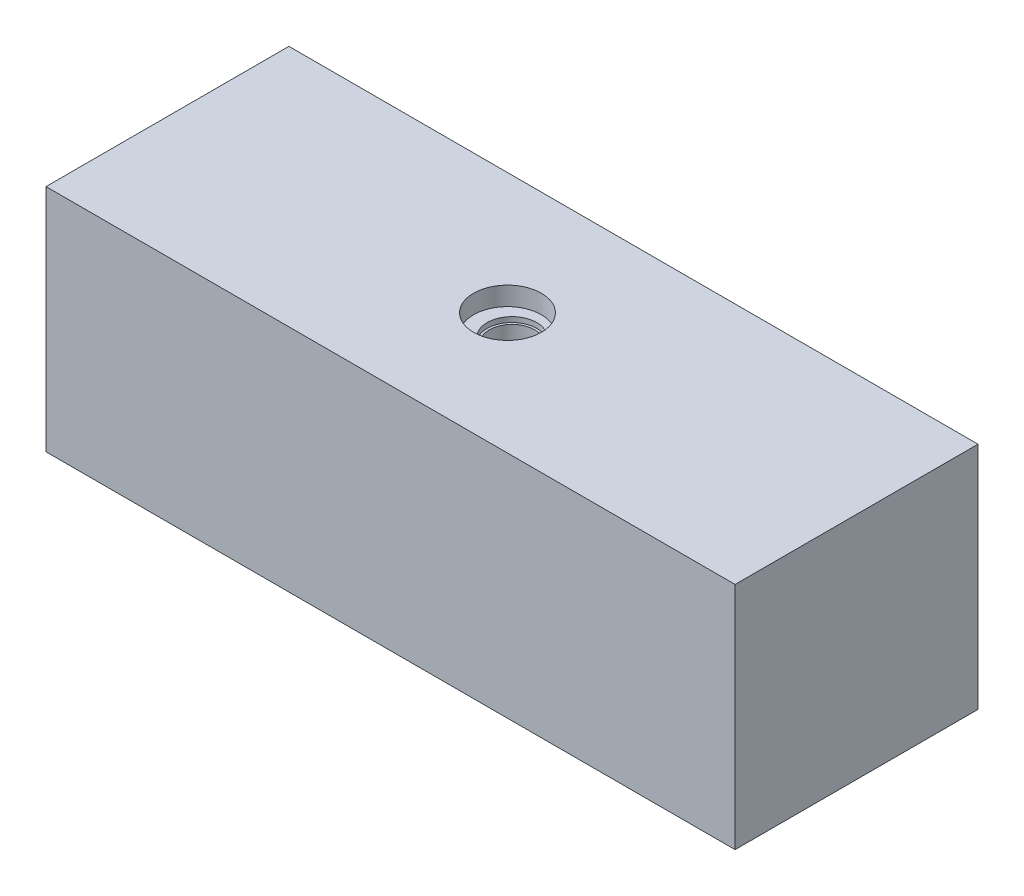
ISO-10303-21;
HEADER;
FILE_DESCRIPTION(('STEP AP214'),'2;1');
FILE_NAME('part.step','',(''),(''),'','','');
FILE_SCHEMA(('AUTOMOTIVE_DESIGN { 1 0 10303 214 1 1 1 1 }'));
ENDSEC;
DATA;
#1=APPLICATION_CONTEXT('core data for automotive mechanical design processes');
#2=APPLICATION_PROTOCOL_DEFINITION('international standard','automotive_design',2000,#1);
#3=PRODUCT_CONTEXT('',#1,'mechanical');
#4=PRODUCT('Part','Part','',(#3));
#5=PRODUCT_RELATED_PRODUCT_CATEGORY('part','',(#4));
#6=PRODUCT_DEFINITION_FORMATION('','',#4);
#7=PRODUCT_DEFINITION_CONTEXT('part definition',#1,'design');
#8=PRODUCT_DEFINITION('design','',#6,#7);
#9=PRODUCT_DEFINITION_SHAPE('','',#8);
#10=(LENGTH_UNIT() NAMED_UNIT(*) SI_UNIT(.MILLI.,.METRE.));
#11=(NAMED_UNIT(*) PLANE_ANGLE_UNIT() SI_UNIT($,.RADIAN.));
#12=(NAMED_UNIT(*) SI_UNIT($,.STERADIAN.) SOLID_ANGLE_UNIT());
#13=UNCERTAINTY_MEASURE_WITH_UNIT(LENGTH_MEASURE(1.E-05),#10,'distance_accuracy_value','');
#14=(GEOMETRIC_REPRESENTATION_CONTEXT(3) GLOBAL_UNCERTAINTY_ASSIGNED_CONTEXT((#13)) GLOBAL_UNIT_ASSIGNED_CONTEXT((#10,
#11,#12)) REPRESENTATION_CONTEXT('',''));
#15=CARTESIAN_POINT('',(0.,0.,0.));
#16=DIRECTION('',(0.,0.,1.));
#17=DIRECTION('',(1.,0.,0.));
#18=AXIS2_PLACEMENT_3D('',#15,#16,#17);
#19=CARTESIAN_POINT('',(0.,45.545833,0.));
#20=DIRECTION('',(0.,1.,0.));
#21=DIRECTION('',(0.,0.,1.));
#22=AXIS2_PLACEMENT_3D('',#19,#20,#21);
#23=CYLINDRICAL_SURFACE('',#22,5.5);
#24=CARTESIAN_POINT('',(0.,45.545833,0.));
#25=DIRECTION('',(0.,1.,0.));
#26=DIRECTION('',(0.,0.,1.));
#27=AXIS2_PLACEMENT_3D('',#24,#25,#26);
#28=CIRCLE('',#27,5.5);
#29=CARTESIAN_POINT('',(0.,45.545833,5.5));
#30=VERTEX_POINT('',#29);
#31=EDGE_CURVE('E137',#30,#30,#28,.T.);
#32=ORIENTED_EDGE('',*,*,#31,.F.);
#33=EDGE_LOOP('',(#32));
#34=FACE_BOUND('',#33,.T.);
#35=CARTESIAN_POINT('',(0.,46.676894,0.));
#36=DIRECTION('',(0.,1.,0.));
#37=DIRECTION('',(0.,0.,1.));
#38=AXIS2_PLACEMENT_3D('',#35,#36,#37);
#39=CIRCLE('',#38,5.5);
#40=CARTESIAN_POINT('',(0.,46.676894,5.5));
#41=VERTEX_POINT('',#40);
#42=EDGE_CURVE('E150',#41,#41,#39,.T.);
#43=ORIENTED_EDGE('',*,*,#42,.T.);
#44=EDGE_LOOP('',(#43));
#45=FACE_BOUND('',#44,.T.);
#46=ADVANCED_FACE('F44',(#34,#45),#23,.F.);
#47=CARTESIAN_POINT('',(0.,45.545833,0.));
#48=DIRECTION('',(0.,1.,0.));
#49=DIRECTION('',(0.,0.,1.));
#50=AXIS2_PLACEMENT_3D('',#47,#48,#49);
#51=PLANE('',#50);
#52=CARTESIAN_POINT('',(0.,45.545833,0.));
#53=DIRECTION('',(0.,1.,0.));
#54=DIRECTION('',(0.,0.,1.));
#55=AXIS2_PLACEMENT_3D('',#52,#53,#54);
#56=CIRCLE('',#55,5.);
#57=CARTESIAN_POINT('',(0.,45.545833,5.));
#58=VERTEX_POINT('',#57);
#59=EDGE_CURVE('E141',#58,#58,#56,.T.);
#60=ORIENTED_EDGE('',*,*,#59,.F.);
#61=EDGE_LOOP('',(#60));
#62=FACE_BOUND('',#61,.T.);
#63=ORIENTED_EDGE('',*,*,#31,.T.);
#64=EDGE_LOOP('',(#63));
#65=FACE_BOUND('',#64,.T.);
#66=ADVANCED_FACE('F180',(#62,#65),#51,.T.);
#67=CARTESIAN_POINT('',(0.,31.383333,0.));
#68=DIRECTION('',(0.,1.,0.));
#69=DIRECTION('',(0.,0.,1.));
#70=AXIS2_PLACEMENT_3D('',#67,#68,#69);
#71=PLANE('',#70);
#72=CARTESIAN_POINT('',(0.,31.383333,0.));
#73=DIRECTION('',(0.,1.,0.));
#74=DIRECTION('',(0.,0.,1.));
#75=AXIS2_PLACEMENT_3D('',#72,#73,#74);
#76=CIRCLE('',#75,5.);
#77=CARTESIAN_POINT('',(0.,31.383333,5.));
#78=VERTEX_POINT('',#77);
#79=EDGE_CURVE('E117',#78,#78,#76,.T.);
#80=ORIENTED_EDGE('',*,*,#79,.T.);
#81=EDGE_LOOP('',(#80));
#82=FACE_BOUND('',#81,.T.);
#83=ADVANCED_FACE('F187',(#82),#71,.T.);
#84=CARTESIAN_POINT('',(0.,31.383333,0.));
#85=DIRECTION('',(0.,1.,0.));
#86=DIRECTION('',(0.,0.,1.));
#87=AXIS2_PLACEMENT_3D('',#84,#85,#86);
#88=CYLINDRICAL_SURFACE('',#87,5.);
#89=ORIENTED_EDGE('',*,*,#79,.F.);
#90=EDGE_LOOP('',(#89));
#91=FACE_BOUND('',#90,.T.);
#92=ORIENTED_EDGE('',*,*,#59,.T.);
#93=EDGE_LOOP('',(#92));
#94=FACE_BOUND('',#93,.T.);
#95=ADVANCED_FACE('F168',(#91,#94),#88,.F.);
#96=CARTESIAN_POINT('',(-1.,46.676894,0.));
#97=DIRECTION('',(0.,1.,0.));
#98=DIRECTION('',(0.,0.,1.));
#99=AXIS2_PLACEMENT_3D('',#96,#97,#98);
#100=CYLINDRICAL_SURFACE('',#99,7.5);
#101=CARTESIAN_POINT('',(-1.,46.676894,0.));
#102=DIRECTION('',(0.,1.,0.));
#103=DIRECTION('',(0.,0.,1.));
#104=AXIS2_PLACEMENT_3D('',#101,#102,#103);
#105=CIRCLE('',#104,7.5);
#106=CARTESIAN_POINT('',(-1.,46.676894,7.5));
#107=VERTEX_POINT('',#106);
#108=EDGE_CURVE('E145',#107,#107,#105,.T.);
#109=ORIENTED_EDGE('',*,*,#108,.F.);
#110=EDGE_LOOP('',(#109));
#111=FACE_BOUND('',#110,.T.);
#112=CARTESIAN_POINT('',(-1.,50.8,0.));
#113=DIRECTION('',(0.,1.,0.));
#114=DIRECTION('',(0.,0.,1.));
#115=AXIS2_PLACEMENT_3D('',#112,#113,#114);
#116=CIRCLE('',#115,7.5);
#117=CARTESIAN_POINT('',(-1.,50.8,7.5));
#118=VERTEX_POINT('',#117);
#119=EDGE_CURVE('E146',#118,#118,#116,.T.);
#120=ORIENTED_EDGE('',*,*,#119,.T.);
#121=EDGE_LOOP('',(#120));
#122=FACE_BOUND('',#121,.T.);
#123=ADVANCED_FACE('F162',(#111,#122),#100,.F.);
#124=CARTESIAN_POINT('',(0.,46.676894,0.));
#125=DIRECTION('',(0.,1.,0.));
#126=DIRECTION('',(0.,0.,1.));
#127=AXIS2_PLACEMENT_3D('',#124,#125,#126);
#128=PLANE('',#127);
#129=ORIENTED_EDGE('',*,*,#42,.F.);
#130=EDGE_LOOP('',(#129));
#131=FACE_BOUND('',#130,.T.);
#132=ORIENTED_EDGE('',*,*,#108,.T.);
#133=EDGE_LOOP('',(#132));
#134=FACE_BOUND('',#133,.T.);
#135=ADVANCED_FACE('F159',(#131,#134),#128,.T.);
#136=CARTESIAN_POINT('',(0.,0.,0.));
#137=DIRECTION('',(0.,1.,0.));
#138=DIRECTION('',(0.,0.,1.));
#139=AXIS2_PLACEMENT_3D('',#136,#137,#138);
#140=PLANE('',#139);
#141=DIRECTION('',(0.,0.,1.));
#142=VECTOR('',#141,1.);
#143=CARTESIAN_POINT('',(-76.2,0.,26.8605));
#144=LINE('',#143,#142);
#145=CARTESIAN_POINT('',(-76.2,0.,-26.8605));
#146=VERTEX_POINT('',#145);
#147=CARTESIAN_POINT('',(-76.2,0.,26.8605));
#148=VERTEX_POINT('',#147);
#149=EDGE_CURVE('E113',#146,#148,#144,.T.);
#150=ORIENTED_EDGE('',*,*,#149,.F.);
#151=DIRECTION('',(-1.,0.,0.));
#152=VECTOR('',#151,1.);
#153=CARTESIAN_POINT('',(76.2,0.,-26.8605));
#154=LINE('',#153,#152);
#155=CARTESIAN_POINT('',(76.2,0.,-26.8605));
#156=VERTEX_POINT('',#155);
#157=EDGE_CURVE('E85',#156,#146,#154,.T.);
#158=ORIENTED_EDGE('',*,*,#157,.F.);
#159=DIRECTION('',(0.,0.,-1.));
#160=VECTOR('',#159,1.);
#161=CARTESIAN_POINT('',(76.2,0.,26.8605));
#162=LINE('',#161,#160);
#163=CARTESIAN_POINT('',(76.2,0.,26.8605));
#164=VERTEX_POINT('',#163);
#165=EDGE_CURVE('E79',#164,#156,#162,.T.);
#166=ORIENTED_EDGE('',*,*,#165,.F.);
#167=DIRECTION('',(1.,0.,0.));
#168=VECTOR('',#167,1.);
#169=CARTESIAN_POINT('',(76.2,0.,26.8605));
#170=LINE('',#169,#168);
#171=EDGE_CURVE('E102',#148,#164,#170,.T.);
#172=ORIENTED_EDGE('',*,*,#171,.F.);
#173=EDGE_LOOP('',(#150,#158,#166,#172));
#174=FACE_BOUND('',#173,.T.);
#175=ADVANCED_FACE('F130',(#174),#140,.F.);
#176=CARTESIAN_POINT('',(76.2,50.8,-26.8605));
#177=DIRECTION('',(0.,0.,1.));
#178=DIRECTION('',(1.,0.,0.));
#179=AXIS2_PLACEMENT_3D('',#176,#177,#178);
#180=PLANE('',#179);
#181=ORIENTED_EDGE('',*,*,#157,.T.);
#182=DIRECTION('',(0.,-1.,0.));
#183=VECTOR('',#182,1.);
#184=CARTESIAN_POINT('',(-76.2,50.8,-26.8605));
#185=LINE('',#184,#183);
#186=CARTESIAN_POINT('',(-76.2,50.8,-26.8605));
#187=VERTEX_POINT('',#186);
#188=EDGE_CURVE('E109',#187,#146,#185,.T.);
#189=ORIENTED_EDGE('',*,*,#188,.F.);
#190=DIRECTION('',(-1.,0.,0.));
#191=VECTOR('',#190,1.);
#192=CARTESIAN_POINT('',(76.2,50.8,-26.8605));
#193=LINE('',#192,#191);
#194=CARTESIAN_POINT('',(76.2,50.8,-26.8605));
#195=VERTEX_POINT('',#194);
#196=EDGE_CURVE('E62',#195,#187,#193,.T.);
#197=ORIENTED_EDGE('',*,*,#196,.F.);
#198=DIRECTION('',(0.,-1.,0.));
#199=VECTOR('',#198,1.);
#200=CARTESIAN_POINT('',(76.2,50.8,-26.8605));
#201=LINE('',#200,#199);
#202=EDGE_CURVE('E104',#195,#156,#201,.T.);
#203=ORIENTED_EDGE('',*,*,#202,.T.);
#204=EDGE_LOOP('',(#181,#189,#197,#203));
#205=FACE_BOUND('',#204,.T.);
#206=ADVANCED_FACE('F127',(#205),#180,.F.);
#207=CARTESIAN_POINT('',(76.2,50.8,26.8605));
#208=DIRECTION('',(-1.,0.,0.));
#209=DIRECTION('',(0.,0.,1.));
#210=AXIS2_PLACEMENT_3D('',#207,#208,#209);
#211=PLANE('',#210);
#212=ORIENTED_EDGE('',*,*,#165,.T.);
#213=ORIENTED_EDGE('',*,*,#202,.F.);
#214=DIRECTION('',(0.,0.,-1.));
#215=VECTOR('',#214,1.);
#216=CARTESIAN_POINT('',(76.2,50.8,26.8605));
#217=LINE('',#216,#215);
#218=CARTESIAN_POINT('',(76.2,50.8,26.8605));
#219=VERTEX_POINT('',#218);
#220=EDGE_CURVE('E95',#219,#195,#217,.T.);
#221=ORIENTED_EDGE('',*,*,#220,.F.);
#222=DIRECTION('',(0.,-1.,0.));
#223=VECTOR('',#222,1.);
#224=CARTESIAN_POINT('',(76.2,50.8,26.8605));
#225=LINE('',#224,#223);
#226=EDGE_CURVE('E54',#219,#164,#225,.T.);
#227=ORIENTED_EDGE('',*,*,#226,.T.);
#228=EDGE_LOOP('',(#212,#213,#221,#227));
#229=FACE_BOUND('',#228,.T.);
#230=ADVANCED_FACE('F105',(#229),#211,.F.);
#231=CARTESIAN_POINT('',(76.2,50.8,26.8605));
#232=DIRECTION('',(0.,0.,-1.));
#233=DIRECTION('',(-1.,0.,0.));
#234=AXIS2_PLACEMENT_3D('',#231,#232,#233);
#235=PLANE('',#234);
#236=ORIENTED_EDGE('',*,*,#171,.T.);
#237=ORIENTED_EDGE('',*,*,#226,.F.);
#238=DIRECTION('',(1.,0.,0.));
#239=VECTOR('',#238,1.);
#240=CARTESIAN_POINT('',(76.2,50.8,26.8605));
#241=LINE('',#240,#239);
#242=CARTESIAN_POINT('',(-76.2,50.8,26.8605));
#243=VERTEX_POINT('',#242);
#244=EDGE_CURVE('E92',#243,#219,#241,.T.);
#245=ORIENTED_EDGE('',*,*,#244,.F.);
#246=DIRECTION('',(0.,-1.,0.));
#247=VECTOR('',#246,1.);
#248=CARTESIAN_POINT('',(-76.2,50.8,26.8605));
#249=LINE('',#248,#247);
#250=EDGE_CURVE('E11',#243,#148,#249,.T.);
#251=ORIENTED_EDGE('',*,*,#250,.T.);
#252=EDGE_LOOP('',(#236,#237,#245,#251));
#253=FACE_BOUND('',#252,.T.);
#254=ADVANCED_FACE('F101',(#253),#235,.F.);
#255=CARTESIAN_POINT('',(-76.2,50.8,26.8605));
#256=DIRECTION('',(1.,0.,0.));
#257=DIRECTION('',(0.,0.,-1.));
#258=AXIS2_PLACEMENT_3D('',#255,#256,#257);
#259=PLANE('',#258);
#260=ORIENTED_EDGE('',*,*,#149,.T.);
#261=ORIENTED_EDGE('',*,*,#250,.F.);
#262=DIRECTION('',(0.,0.,1.));
#263=VECTOR('',#262,1.);
#264=CARTESIAN_POINT('',(-76.2,50.8,26.8605));
#265=LINE('',#264,#263);
#266=EDGE_CURVE('E97',#187,#243,#265,.T.);
#267=ORIENTED_EDGE('',*,*,#266,.F.);
#268=ORIENTED_EDGE('',*,*,#188,.T.);
#269=EDGE_LOOP('',(#260,#261,#267,#268));
#270=FACE_BOUND('',#269,.T.);
#271=ADVANCED_FACE('F46',(#270),#259,.F.);
#272=CARTESIAN_POINT('',(0.,50.8,0.));
#273=DIRECTION('',(0.,1.,0.));
#274=DIRECTION('',(0.,0.,1.));
#275=AXIS2_PLACEMENT_3D('',#272,#273,#274);
#276=PLANE('',#275);
#277=ORIENTED_EDGE('',*,*,#119,.F.);
#278=EDGE_LOOP('',(#277));
#279=FACE_BOUND('',#278,.T.);
#280=ORIENTED_EDGE('',*,*,#266,.T.);
#281=ORIENTED_EDGE('',*,*,#244,.T.);
#282=ORIENTED_EDGE('',*,*,#220,.T.);
#283=ORIENTED_EDGE('',*,*,#196,.T.);
#284=EDGE_LOOP('',(#280,#281,#282,#283));
#285=FACE_BOUND('',#284,.T.);
#286=ADVANCED_FACE('F93',(#279,#285),#276,.T.);
#287=CLOSED_SHELL('',(#46,#66,#83,#95,#123,#135,#175,#206,#230,#254,#271,#286));
#288=MANIFOLD_SOLID_BREP('B2',#287);
#289=ADVANCED_BREP_SHAPE_REPRESENTATION('',(#18,#288),#14);
#290=SHAPE_DEFINITION_REPRESENTATION(#9,#289);
ENDSEC;
END-ISO-10303-21;
